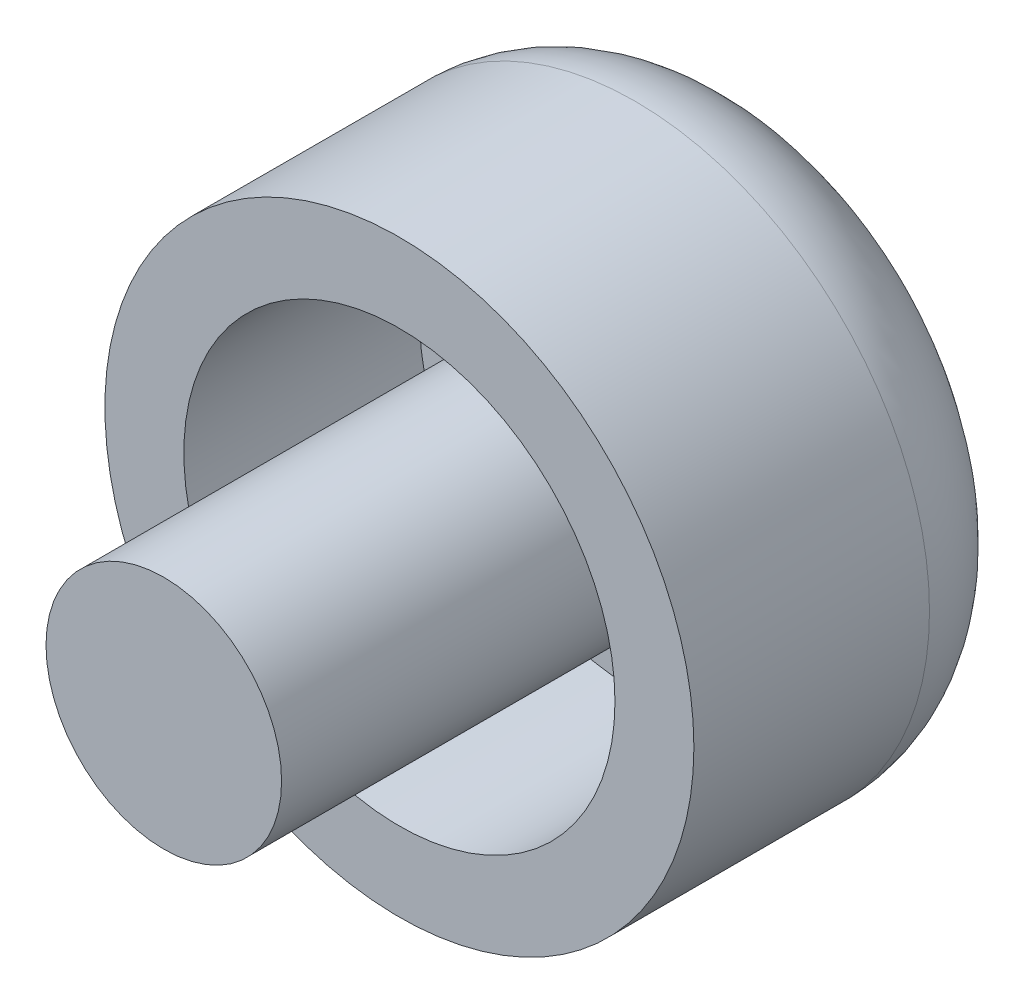
ISO-10303-21;
HEADER;
FILE_DESCRIPTION(('STEP AP214'),'2;1');
FILE_NAME('part.step','',(''),(''),'','','');
FILE_SCHEMA(('AUTOMOTIVE_DESIGN { 1 0 10303 214 1 1 1 1 }'));
ENDSEC;
DATA;
#1=APPLICATION_CONTEXT('core data for automotive mechanical design processes');
#2=APPLICATION_PROTOCOL_DEFINITION('international standard','automotive_design',2000,#1);
#3=PRODUCT_CONTEXT('',#1,'mechanical');
#4=PRODUCT('Part','Part','',(#3));
#5=PRODUCT_RELATED_PRODUCT_CATEGORY('part','',(#4));
#6=PRODUCT_DEFINITION_FORMATION('','',#4);
#7=PRODUCT_DEFINITION_CONTEXT('part definition',#1,'design');
#8=PRODUCT_DEFINITION('design','',#6,#7);
#9=PRODUCT_DEFINITION_SHAPE('','',#8);
#10=(LENGTH_UNIT() NAMED_UNIT(*) SI_UNIT(.MILLI.,.METRE.));
#11=(NAMED_UNIT(*) PLANE_ANGLE_UNIT() SI_UNIT($,.RADIAN.));
#12=(NAMED_UNIT(*) SI_UNIT($,.STERADIAN.) SOLID_ANGLE_UNIT());
#13=UNCERTAINTY_MEASURE_WITH_UNIT(LENGTH_MEASURE(1.E-05),#10,'distance_accuracy_value','');
#14=(GEOMETRIC_REPRESENTATION_CONTEXT(3) GLOBAL_UNCERTAINTY_ASSIGNED_CONTEXT((#13)) GLOBAL_UNIT_ASSIGNED_CONTEXT((#10,
#11,#12)) REPRESENTATION_CONTEXT('',''));
#15=CARTESIAN_POINT('',(0.,0.,0.));
#16=DIRECTION('',(0.,0.,1.));
#17=DIRECTION('',(1.,0.,0.));
#18=AXIS2_PLACEMENT_3D('',#15,#16,#17);
#19=CARTESIAN_POINT('',(0.,0.,0.));
#20=DIRECTION('',(0.,0.,-1.));
#21=DIRECTION('',(-1.,0.,0.));
#22=AXIS2_PLACEMENT_3D('',#19,#20,#21);
#23=PLANE('',#22);
#24=CARTESIAN_POINT('',(0.,0.,0.));
#25=DIRECTION('',(0.,0.,1.));
#26=DIRECTION('',(1.,0.,0.));
#27=AXIS2_PLACEMENT_3D('',#24,#25,#26);
#28=CIRCLE('',#27,5.);
#29=CARTESIAN_POINT('',(5.,0.,0.));
#30=VERTEX_POINT('',#29);
#31=EDGE_CURVE('E53',#30,#30,#28,.T.);
#32=ORIENTED_EDGE('',*,*,#31,.F.);
#33=EDGE_LOOP('',(#32));
#34=FACE_BOUND('',#33,.T.);
#35=CARTESIAN_POINT('',(0.,0.,0.));
#36=DIRECTION('',(0.,0.,1.));
#37=DIRECTION('',(1.,0.,0.));
#38=AXIS2_PLACEMENT_3D('',#35,#36,#37);
#39=CIRCLE('',#38,9.15);
#40=CARTESIAN_POINT('',(9.15,0.,0.));
#41=VERTEX_POINT('',#40);
#42=EDGE_CURVE('E61',#41,#41,#39,.T.);
#43=ORIENTED_EDGE('',*,*,#42,.T.);
#44=EDGE_LOOP('',(#43));
#45=FACE_BOUND('',#44,.T.);
#46=ADVANCED_FACE('F39',(#34,#45),#23,.F.);
#47=CARTESIAN_POINT('',(0.,0.,20.));
#48=DIRECTION('',(0.,0.,-1.));
#49=DIRECTION('',(-1.,0.,0.));
#50=AXIS2_PLACEMENT_3D('',#47,#48,#49);
#51=CYLINDRICAL_SURFACE('',#50,5.);
#52=CARTESIAN_POINT('',(0.,0.,20.));
#53=DIRECTION('',(0.,0.,1.));
#54=DIRECTION('',(1.,0.,0.));
#55=AXIS2_PLACEMENT_3D('',#52,#53,#54);
#56=CIRCLE('',#55,5.);
#57=CARTESIAN_POINT('',(5.,0.,20.));
#58=VERTEX_POINT('',#57);
#59=EDGE_CURVE('E49',#58,#58,#56,.T.);
#60=ORIENTED_EDGE('',*,*,#59,.F.);
#61=EDGE_LOOP('',(#60));
#62=FACE_BOUND('',#61,.T.);
#63=ORIENTED_EDGE('',*,*,#31,.T.);
#64=EDGE_LOOP('',(#63));
#65=FACE_BOUND('',#64,.T.);
#66=ADVANCED_FACE('F83',(#62,#65),#51,.T.);
#67=CARTESIAN_POINT('',(0.,0.,20.));
#68=DIRECTION('',(0.,0.,1.));
#69=DIRECTION('',(1.,0.,0.));
#70=AXIS2_PLACEMENT_3D('',#67,#68,#69);
#71=PLANE('',#70);
#72=ORIENTED_EDGE('',*,*,#59,.T.);
#73=EDGE_LOOP('',(#72));
#74=FACE_BOUND('',#73,.T.);
#75=ADVANCED_FACE('F74',(#74),#71,.T.);
#76=CARTESIAN_POINT('',(0.,0.,10.));
#77=DIRECTION('',(0.,0.,1.));
#78=DIRECTION('',(1.,0.,0.));
#79=AXIS2_PLACEMENT_3D('',#76,#77,#78);
#80=PLANE('',#79);
#81=CARTESIAN_POINT('',(0.,0.,10.));
#82=DIRECTION('',(0.,0.,1.));
#83=DIRECTION('',(1.,0.,0.));
#84=AXIS2_PLACEMENT_3D('',#81,#82,#83);
#85=CIRCLE('',#84,12.5);
#86=CARTESIAN_POINT('',(12.5,0.,10.));
#87=VERTEX_POINT('',#86);
#88=EDGE_CURVE('E59',#87,#87,#85,.T.);
#89=ORIENTED_EDGE('',*,*,#88,.T.);
#90=EDGE_LOOP('',(#89));
#91=FACE_BOUND('',#90,.T.);
#92=CARTESIAN_POINT('',(0.,0.,10.));
#93=DIRECTION('',(0.,0.,1.));
#94=DIRECTION('',(1.,0.,0.));
#95=AXIS2_PLACEMENT_3D('',#92,#93,#94);
#96=CIRCLE('',#95,9.15);
#97=CARTESIAN_POINT('',(9.15,0.,10.));
#98=VERTEX_POINT('',#97);
#99=EDGE_CURVE('E65',#98,#98,#96,.T.);
#100=ORIENTED_EDGE('',*,*,#99,.F.);
#101=EDGE_LOOP('',(#100));
#102=FACE_BOUND('',#101,.T.);
#103=ADVANCED_FACE('F75',(#91,#102),#80,.T.);
#104=CARTESIAN_POINT('',(0.,0.,10.));
#105=DIRECTION('',(0.,0.,-1.));
#106=DIRECTION('',(-1.,0.,0.));
#107=AXIS2_PLACEMENT_3D('',#104,#105,#106);
#108=CYLINDRICAL_SURFACE('',#107,9.15);
#109=ORIENTED_EDGE('',*,*,#99,.T.);
#110=EDGE_LOOP('',(#109));
#111=FACE_BOUND('',#110,.T.);
#112=ORIENTED_EDGE('',*,*,#42,.F.);
#113=EDGE_LOOP('',(#112));
#114=FACE_BOUND('',#113,.T.);
#115=ADVANCED_FACE('F68',(#111,#114),#108,.F.);
#116=CARTESIAN_POINT('',(0.,0.,-5.));
#117=DIRECTION('',(0.,0.,-1.));
#118=DIRECTION('',(-1.,0.,0.));
#119=AXIS2_PLACEMENT_3D('',#116,#117,#118);
#120=PLANE('',#119);
#121=CARTESIAN_POINT('',(0.,0.,-5.));
#122=DIRECTION('',(0.,0.,-1.));
#123=DIRECTION('',(-1.,0.,0.));
#124=AXIS2_PLACEMENT_3D('',#121,#122,#123);
#125=CIRCLE('',#124,7.5);
#126=CARTESIAN_POINT('',(-7.5,0.,-5.));
#127=VERTEX_POINT('',#126);
#128=EDGE_CURVE('E46',#127,#127,#125,.T.);
#129=ORIENTED_EDGE('',*,*,#128,.T.);
#130=EDGE_LOOP('',(#129));
#131=FACE_BOUND('',#130,.T.);
#132=ADVANCED_FACE('F84',(#131),#120,.T.);
#133=CARTESIAN_POINT('',(0.,0.,-5.));
#134=DIRECTION('',(0.,0.,1.));
#135=DIRECTION('',(1.,0.,0.));
#136=AXIS2_PLACEMENT_3D('',#133,#134,#135);
#137=CYLINDRICAL_SURFACE('',#136,12.5);
#138=CARTESIAN_POINT('',(0.,0.,0.));
#139=DIRECTION('',(0.,0.,-1.));
#140=DIRECTION('',(-1.,0.,0.));
#141=AXIS2_PLACEMENT_3D('',#138,#139,#140);
#142=CIRCLE('',#141,12.5);
#143=CARTESIAN_POINT('',(-12.5,0.,0.));
#144=VERTEX_POINT('',#143);
#145=EDGE_CURVE('E10',#144,#144,#142,.F.);
#146=ORIENTED_EDGE('',*,*,#145,.T.);
#147=EDGE_LOOP('',(#146));
#148=FACE_BOUND('',#147,.T.);
#149=ORIENTED_EDGE('',*,*,#88,.F.);
#150=EDGE_LOOP('',(#149));
#151=FACE_BOUND('',#150,.T.);
#152=ADVANCED_FACE('F100',(#148,#151),#137,.T.);
#153=CARTESIAN_POINT('',(0.,0.,0.));
#154=DIRECTION('',(0.,0.,-1.));
#155=DIRECTION('',(-1.,0.,0.));
#156=AXIS2_PLACEMENT_3D('',#153,#154,#155);
#157=TOROIDAL_SURFACE('',#156,7.5,5.);
#158=ORIENTED_EDGE('',*,*,#145,.F.);
#159=EDGE_LOOP('',(#158));
#160=FACE_BOUND('',#159,.T.);
#161=ORIENTED_EDGE('',*,*,#128,.F.);
#162=EDGE_LOOP('',(#161));
#163=FACE_BOUND('',#162,.T.);
#164=ADVANCED_FACE('F41',(#160,#163),#157,.T.);
#165=CLOSED_SHELL('',(#46,#66,#75,#103,#115,#132,#152,#164));
#166=MANIFOLD_SOLID_BREP('B2',#165);
#167=ADVANCED_BREP_SHAPE_REPRESENTATION('',(#18,#166),#14);
#168=SHAPE_DEFINITION_REPRESENTATION(#9,#167);
ENDSEC;
END-ISO-10303-21;
